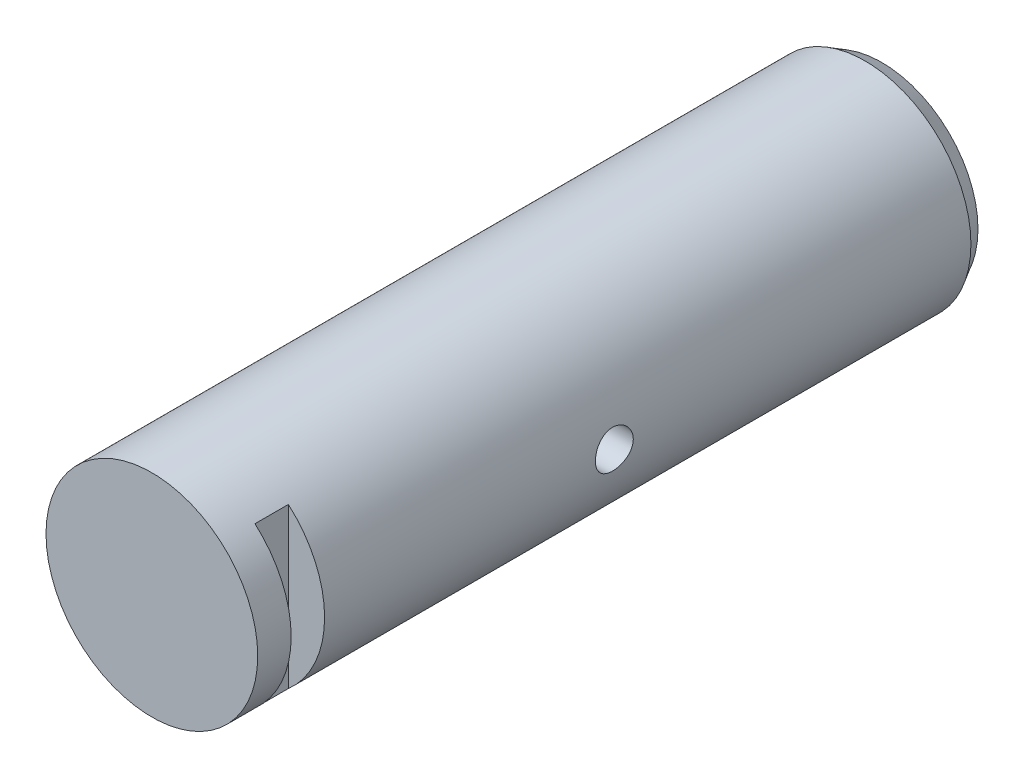
ISO-10303-21;
HEADER;
FILE_DESCRIPTION(('STEP AP214'),'2;1');
FILE_NAME('part.step','',(''),(''),'','','');
FILE_SCHEMA(('AUTOMOTIVE_DESIGN { 1 0 10303 214 1 1 1 1 }'));
ENDSEC;
DATA;
#1=APPLICATION_CONTEXT('core data for automotive mechanical design processes');
#2=APPLICATION_PROTOCOL_DEFINITION('international standard','automotive_design',2000,#1);
#3=PRODUCT_CONTEXT('',#1,'mechanical');
#4=PRODUCT('Part','Part','',(#3));
#5=PRODUCT_RELATED_PRODUCT_CATEGORY('part','',(#4));
#6=PRODUCT_DEFINITION_FORMATION('','',#4);
#7=PRODUCT_DEFINITION_CONTEXT('part definition',#1,'design');
#8=PRODUCT_DEFINITION('design','',#6,#7);
#9=PRODUCT_DEFINITION_SHAPE('','',#8);
#10=(LENGTH_UNIT() NAMED_UNIT(*) SI_UNIT(.MILLI.,.METRE.));
#11=(NAMED_UNIT(*) PLANE_ANGLE_UNIT() SI_UNIT($,.RADIAN.));
#12=(NAMED_UNIT(*) SI_UNIT($,.STERADIAN.) SOLID_ANGLE_UNIT());
#13=UNCERTAINTY_MEASURE_WITH_UNIT(LENGTH_MEASURE(1.E-05),#10,'distance_accuracy_value','');
#14=(GEOMETRIC_REPRESENTATION_CONTEXT(3) GLOBAL_UNCERTAINTY_ASSIGNED_CONTEXT((#13)) GLOBAL_UNIT_ASSIGNED_CONTEXT((#10,
#11,#12)) REPRESENTATION_CONTEXT('',''));
#15=CARTESIAN_POINT('',(0.,0.,0.));
#16=DIRECTION('',(0.,0.,1.));
#17=DIRECTION('',(1.,0.,0.));
#18=AXIS2_PLACEMENT_3D('',#15,#16,#17);
#19=CARTESIAN_POINT('',(0.,0.,-56.));
#20=DIRECTION('',(0.,0.,-1.));
#21=DIRECTION('',(-1.,0.,0.));
#22=AXIS2_PLACEMENT_3D('',#19,#20,#21);
#23=CYLINDRICAL_SURFACE('',#22,3.39999999999999);
#24=CARTESIAN_POINT('',(0.,0.,-56.));
#25=DIRECTION('',(0.,0.,-1.));
#26=DIRECTION('',(-1.,0.,0.));
#27=AXIS2_PLACEMENT_3D('',#24,#25,#26);
#28=CIRCLE('',#27,3.39999999999999);
#29=CARTESIAN_POINT('',(-3.39999999999999,0.,-56.));
#30=VERTEX_POINT('',#29);
#31=EDGE_CURVE('E198',#30,#30,#28,.T.);
#32=ORIENTED_EDGE('',*,*,#31,.T.);
#33=EDGE_LOOP('',(#32));
#34=FACE_BOUND('',#33,.T.);
#35=CARTESIAN_POINT('',(0.,0.,11.));
#36=DIRECTION('',(-0.707106781186547,0.,-0.707106781186547));
#37=DIRECTION('',(0.707106781186547,0.,-0.707106781186547));
#38=AXIS2_PLACEMENT_3D('',#35,#36,#37);
#39=ELLIPSE('',#38,4.80832611206851,3.39999999999999);
#40=CARTESIAN_POINT('',(0.,-3.4,11.));
#41=VERTEX_POINT('',#40);
#42=CARTESIAN_POINT('',(0.,3.39999999999999,11.));
#43=VERTEX_POINT('',#42);
#44=EDGE_CURVE('E202',#41,#43,#39,.F.);
#45=ORIENTED_EDGE('',*,*,#44,.T.);
#46=CARTESIAN_POINT('',(0.,0.,11.));
#47=DIRECTION('',(0.707106781186547,0.,-0.707106781186547));
#48=DIRECTION('',(-0.707106781186547,0.,-0.707106781186547));
#49=AXIS2_PLACEMENT_3D('',#46,#47,#48);
#50=ELLIPSE('',#49,4.80832611206851,3.39999999999999);
#51=EDGE_CURVE('E77',#43,#41,#50,.F.);
#52=ORIENTED_EDGE('',*,*,#51,.T.);
#53=EDGE_LOOP('',(#45,#52));
#54=FACE_BOUND('',#53,.T.);
#55=ADVANCED_FACE('F58',(#34,#54),#23,.F.);
#56=CARTESIAN_POINT('',(0.,0.,-56.));
#57=DIRECTION('',(0.,0.,1.));
#58=DIRECTION('',(1.,0.,0.));
#59=AXIS2_PLACEMENT_3D('',#56,#57,#58);
#60=CYLINDRICAL_SURFACE('',#59,19.);
#61=DIRECTION('',(0.,0.,1.));
#62=VECTOR('',#61,1.);
#63=CARTESIAN_POINT('',(12.5,-14.3090880212542,-56.));
#64=LINE('',#63,#62);
#65=CARTESIAN_POINT('',(12.5,-14.3090880212542,69.));
#66=VERTEX_POINT('',#65);
#67=CARTESIAN_POINT('',(12.5,-14.3090880212542,63.));
#68=VERTEX_POINT('',#67);
#69=EDGE_CURVE('E68',#66,#68,#64,.F.);
#70=ORIENTED_EDGE('',*,*,#69,.F.);
#71=CARTESIAN_POINT('',(0.,0.,69.));
#72=DIRECTION('',(0.,0.,1.));
#73=DIRECTION('',(1.,0.,0.));
#74=AXIS2_PLACEMENT_3D('',#71,#72,#73);
#75=CIRCLE('',#74,19.);
#76=CARTESIAN_POINT('',(12.5,14.3090880212542,69.));
#77=VERTEX_POINT('',#76);
#78=EDGE_CURVE('E11',#77,#66,#75,.F.);
#79=ORIENTED_EDGE('',*,*,#78,.F.);
#80=DIRECTION('',(0.,0.,1.));
#81=VECTOR('',#80,1.);
#82=CARTESIAN_POINT('',(12.5,14.3090880212542,-56.));
#83=LINE('',#82,#81);
#84=CARTESIAN_POINT('',(12.5,14.3090880212542,63.));
#85=VERTEX_POINT('',#84);
#86=EDGE_CURVE('E99',#85,#77,#83,.T.);
#87=ORIENTED_EDGE('',*,*,#86,.F.);
#88=CARTESIAN_POINT('',(0.,0.,63.));
#89=DIRECTION('',(0.,0.,-1.));
#90=DIRECTION('',(-1.,0.,0.));
#91=AXIS2_PLACEMENT_3D('',#88,#89,#90);
#92=CIRCLE('',#91,19.);
#93=EDGE_CURVE('E94',#68,#85,#92,.F.);
#94=ORIENTED_EDGE('',*,*,#93,.F.);
#95=EDGE_LOOP('',(#70,#79,#87,#94));
#96=FACE_BOUND('',#95,.T.);
#97=CARTESIAN_POINT('',(0.,0.,-53.0000000000001));
#98=DIRECTION('',(0.,0.,1.));
#99=DIRECTION('',(1.,0.,0.));
#100=AXIS2_PLACEMENT_3D('',#97,#98,#99);
#101=CIRCLE('',#100,19.);
#102=CARTESIAN_POINT('',(19.,0.,-53.0000000000001));
#103=VERTEX_POINT('',#102);
#104=EDGE_CURVE('E154',#103,#103,#101,.T.);
#105=ORIENTED_EDGE('',*,*,#104,.T.);
#106=EDGE_LOOP('',(#105));
#107=FACE_BOUND('',#106,.T.);
#108=CARTESIAN_POINT('',(-19.,0.,7.60000000000001));
#109=CARTESIAN_POINT('',(-18.9999966349209,-0.189359116148754,7.60000739510284));
#110=CARTESIAN_POINT('',(-18.99713985582,-0.378816292653439,7.6158726611338));
#111=CARTESIAN_POINT('',(-18.9860188360453,-0.752402493709806,7.67887983090921));
#112=CARTESIAN_POINT('',(-18.9777498582218,-0.936526702895269,7.72604913472738));
#113=CARTESIAN_POINT('',(-18.9567304870848,-1.29398914244799,7.85018257048896));
#114=CARTESIAN_POINT('',(-18.9439839809906,-1.46733657564912,7.92712086399056));
#115=CARTESIAN_POINT('',(-18.9154055229009,-1.79864358139372,8.10853729366745));
#116=CARTESIAN_POINT('',(-18.8995738641336,-1.95660461419851,8.21301281290098));
#117=CARTESIAN_POINT('',(-18.8663818606133,-2.25440369777336,8.44775387357689));
#118=CARTESIAN_POINT('',(-18.8490080449846,-2.39404879462585,8.57826232268515));
#119=CARTESIAN_POINT('',(-18.8147911577378,-2.6495837897743,8.86084189315165));
#120=CARTESIAN_POINT('',(-18.797948122286,-2.76547207227252,9.01291447998552));
#121=CARTESIAN_POINT('',(-18.7665691484542,-2.97099402925277,9.33565313650552));
#122=CARTESIAN_POINT('',(-18.7520505970165,-3.06043372862368,9.50644456944872));
#123=CARTESIAN_POINT('',(-18.7271530893692,-3.20927847227692,9.86093146973737));
#124=CARTESIAN_POINT('',(-18.7167738093077,-3.26868586635062,10.0446259262416));
#125=CARTESIAN_POINT('',(-18.7014650301702,-3.35516512484591,10.4176477673485));
#126=CARTESIAN_POINT('',(-18.6964790933344,-3.38257209811784,10.6068951010301));
#127=CARTESIAN_POINT('',(-18.69235114719,-3.40531220803425,10.9873628044778));
#128=CARTESIAN_POINT('',(-18.6932086609569,-3.40064796223401,11.1785830119519));
#129=CARTESIAN_POINT('',(-18.7006192804987,-3.35965028298724,11.5551558211514));
#130=CARTESIAN_POINT('',(-18.7071042060553,-3.32369593703936,11.7405512330063));
#131=CARTESIAN_POINT('',(-18.7249320285173,-3.221734789343,12.1026353029879));
#132=CARTESIAN_POINT('',(-18.7362751150751,-3.15572681435812,12.2793236209078));
#133=CARTESIAN_POINT('',(-18.7626134640921,-2.99515565509624,12.6200980357));
#134=CARTESIAN_POINT('',(-18.7776284515749,-2.90043756235276,12.7841095531177));
#135=CARTESIAN_POINT('',(-18.8096054823071,-2.68524459961301,13.094054289061));
#136=CARTESIAN_POINT('',(-18.8265677059959,-2.56476734176922,13.2399858296095));
#137=CARTESIAN_POINT('',(-18.8608261487862,-2.29942291648305,13.5118201762315));
#138=CARTESIAN_POINT('',(-18.8781236715029,-2.1542310689154,13.637406104729));
#139=CARTESIAN_POINT('',(-18.9108798607181,-1.8446702868463,13.8624837075214));
#140=CARTESIAN_POINT('',(-18.9263385117616,-1.6803011911899,13.9619751625099));
#141=CARTESIAN_POINT('',(-18.9537023046531,-1.33673505364186,14.1320786876557));
#142=CARTESIAN_POINT('',(-18.9656036471012,-1.15752241699953,14.2026599096823));
#143=CARTESIAN_POINT('',(-18.9844820701314,-0.789525108664183,14.3126302553381));
#144=CARTESIAN_POINT('',(-18.9914596264956,-0.600741363711166,14.3520223927931));
#145=CARTESIAN_POINT('',(-18.9996395277903,-0.221689022440057,14.3980601931527));
#146=CARTESIAN_POINT('',(-19.0009184998551,-0.0314747990638467,14.405140376782));
#147=CARTESIAN_POINT('',(-18.9977680347034,0.347420440928693,14.3875158305965));
#148=CARTESIAN_POINT('',(-18.9933388520024,0.536101525527205,14.3628125179457));
#149=CARTESIAN_POINT('',(-18.9793173345974,0.905211583009181,14.2826835680585));
#150=CARTESIAN_POINT('',(-18.9697616265791,1.08568936212386,14.22747578862));
#151=CARTESIAN_POINT('',(-18.9465540454197,1.43482762283372,14.0881393143843));
#152=CARTESIAN_POINT('',(-18.9329019139614,1.60348735836489,14.0040087956934));
#153=CARTESIAN_POINT('',(-18.9028249257681,1.92607037485075,13.8082391156509));
#154=CARTESIAN_POINT('',(-18.8863735762729,2.07982847751297,13.6963319302007));
#155=CARTESIAN_POINT('',(-18.852595910538,2.36653881416634,13.4485507612175));
#156=CARTESIAN_POINT('',(-18.8352695204427,2.49948928804732,13.3126747522355));
#157=CARTESIAN_POINT('',(-18.8014430595408,2.74244444474002,13.0188533637239));
#158=CARTESIAN_POINT('',(-18.78495543858,2.85215381250747,12.8606621275437));
#159=CARTESIAN_POINT('',(-18.7549160166177,3.04344209969357,12.5278403204927));
#160=CARTESIAN_POINT('',(-18.7413641128602,3.12502200376045,12.3532103253193));
#161=CARTESIAN_POINT('',(-18.7188264245687,3.25730709364541,11.9932500098118));
#162=CARTESIAN_POINT('',(-18.7098199252254,3.30815255943244,11.8079725989931));
#163=CARTESIAN_POINT('',(-18.6973434437131,3.37796206615852,11.431330114278));
#164=CARTESIAN_POINT('',(-18.6938728984918,3.39692934938192,11.2399656615035));
#165=CARTESIAN_POINT('',(-18.6928880346328,3.40234319134434,10.8595352488396));
#166=CARTESIAN_POINT('',(-18.6952884808671,3.38925512617539,10.6704759737356));
#167=CARTESIAN_POINT('',(-18.7055870627166,3.3319433273961,10.2972976229357));
#168=CARTESIAN_POINT('',(-18.7134851722051,3.28771974175138,10.1131785237669));
#169=CARTESIAN_POINT('',(-18.7338547388841,3.16958106311173,9.75532754358542));
#170=CARTESIAN_POINT('',(-18.746319103037,3.09571200330979,9.58158003596089));
#171=CARTESIAN_POINT('',(-18.7744225034866,2.92042873118774,9.24886941806226));
#172=CARTESIAN_POINT('',(-18.7900617361021,2.81901281536991,9.08990722292836));
#173=CARTESIAN_POINT('',(-18.8230197247812,2.58987842643082,8.78893976979962));
#174=CARTESIAN_POINT('',(-18.8403585009623,2.46181965856844,8.64719573784659));
#175=CARTESIAN_POINT('',(-18.8746080286539,2.18374808407311,8.38705151465689));
#176=CARTESIAN_POINT('',(-18.8915186808027,2.03373023484456,8.26865669993875));
#177=CARTESIAN_POINT('',(-18.9231663993433,1.71454851307093,8.05768408187032));
#178=CARTESIAN_POINT('',(-18.9378847672342,1.54523951687639,7.96532297096771));
#179=CARTESIAN_POINT('',(-18.9633074648247,1.19330528614379,7.8105005800182));
#180=CARTESIAN_POINT('',(-18.9740156598171,1.01069307810337,7.74801049198693));
#181=CARTESIAN_POINT('',(-18.9879627193211,0.689556735628872,7.66776605789308));
#182=CARTESIAN_POINT('',(-18.992451791999,0.55293907866632,7.64239604090775));
#183=CARTESIAN_POINT('',(-18.998471633606,0.277565147922436,7.6085104844349));
#184=CARTESIAN_POINT('',(-19.0000024667574,0.13880892063465,7.59999457905032));
#185=CARTESIAN_POINT('',(-19.,0.,7.60000000000001));
#186=B_SPLINE_CURVE_WITH_KNOTS('',3,(#108,#109,#110,#111,#112,#113,#114,#115,#116,#117,#118,
#119,#120,#121,#122,#123,#124,#125,#126,#127,#128,#129,#130,#131,#132,#133,#134,#135,#136,#137,
#138,#139,#140,#141,#142,#143,#144,#145,#146,#147,#148,#149,#150,#151,#152,#153,#154,#155,#156,
#157,#158,#159,#160,#161,#162,#163,#164,#165,#166,#167,#168,#169,#170,#171,#172,#173,#174,#175,
#176,#177,#178,#179,#180,#181,#182,#183,#184,#185),.UNSPECIFIED.,.T.,.F.,(4,2,2,2,2,2,2,2,2,2,2,
2,2,2,2,2,2,2,2,2,2,2,2,2,2,2,2,2,2,2,2,2,2,2,2,2,2,2,4),(0.,0.567569821708365,1.13563708729389,
1.70321239244777,2.27073377872327,2.84382163815749,3.41694846270904,3.99417992316399,
4.57136621281049,5.14245239388971,5.71349196520636,6.27770806931202,6.84194620122779,
7.40928463320321,7.97667567967408,8.55219507118145,9.12771929938312,9.70385604029428,
10.2799371018632,10.8482479323349,11.4165334238169,11.9808118150049,12.5451257966195,
13.1151124371865,13.6851472666984,14.2620404102667,14.8389133581249,15.4131330256255,
15.9872942865302,16.5531694756568,17.1190419755876,17.6840391733022,18.2490713184047,
18.8218200155169,19.3947004432856,19.9722172111757,20.5491758853879,20.9652396396078,
21.3812943611257),.UNSPECIFIED.);
#187=CARTESIAN_POINT('',(-19.,0.,7.60000000000001));
#188=VERTEX_POINT('',#187);
#189=EDGE_CURVE('E117',#188,#188,#186,.T.);
#190=ORIENTED_EDGE('',*,*,#189,.F.);
#191=EDGE_LOOP('',(#190));
#192=FACE_BOUND('',#191,.T.);
#193=CARTESIAN_POINT('',(19.,0.,14.4));
#194=CARTESIAN_POINT('',(18.9999966349209,-0.189359116148753,14.3999926048972));
#195=CARTESIAN_POINT('',(18.99713985582,-0.378816292653439,14.3841273388662));
#196=CARTESIAN_POINT('',(18.9860188360453,-0.752402493709806,14.3211201690908));
#197=CARTESIAN_POINT('',(18.9777498582218,-0.936526702895269,14.2739508652726));
#198=CARTESIAN_POINT('',(18.9567304870848,-1.29398914244799,14.1498174295111));
#199=CARTESIAN_POINT('',(18.9439839809906,-1.46733657564912,14.0728791360095));
#200=CARTESIAN_POINT('',(18.9154055229009,-1.79864358139372,13.8914627063326));
#201=CARTESIAN_POINT('',(18.8995738641336,-1.95660461419851,13.786987187099));
#202=CARTESIAN_POINT('',(18.8663818606133,-2.25440369777336,13.5522461264231));
#203=CARTESIAN_POINT('',(18.8490080449846,-2.39404879462585,13.4217376773149));
#204=CARTESIAN_POINT('',(18.8147911577378,-2.6495837897743,13.1391581068484));
#205=CARTESIAN_POINT('',(18.797948122286,-2.76547207227252,12.9870855200145));
#206=CARTESIAN_POINT('',(18.7665691484542,-2.97099402925277,12.6643468634945));
#207=CARTESIAN_POINT('',(18.7520505970165,-3.06043372862368,12.4935554305513));
#208=CARTESIAN_POINT('',(18.7271530893692,-3.20927847227692,12.1390685302627));
#209=CARTESIAN_POINT('',(18.7167738093077,-3.26868586635062,11.9553740737585));
#210=CARTESIAN_POINT('',(18.7014650301702,-3.35516512484591,11.5823522326515));
#211=CARTESIAN_POINT('',(18.6964790933344,-3.38257209811784,11.3931048989699));
#212=CARTESIAN_POINT('',(18.69235114719,-3.40531220803425,11.0126371955222));
#213=CARTESIAN_POINT('',(18.6932086609569,-3.40064796223401,10.8214169880481));
#214=CARTESIAN_POINT('',(18.7006192804987,-3.35965028298724,10.4448441788486));
#215=CARTESIAN_POINT('',(18.7071042060553,-3.32369593703936,10.2594487669937));
#216=CARTESIAN_POINT('',(18.7249320285173,-3.221734789343,9.89736469701213));
#217=CARTESIAN_POINT('',(18.7362751150751,-3.15572681435812,9.72067637909223));
#218=CARTESIAN_POINT('',(18.7626134640921,-2.99515565509624,9.37990196429999));
#219=CARTESIAN_POINT('',(18.7776284515749,-2.90043756235276,9.2158904468823));
#220=CARTESIAN_POINT('',(18.8096054823071,-2.68524459961301,8.90594571093905));
#221=CARTESIAN_POINT('',(18.8265677059959,-2.56476734176922,8.76001417039052));
#222=CARTESIAN_POINT('',(18.8608261487862,-2.29942291648305,8.48817982376854));
#223=CARTESIAN_POINT('',(18.8781236715029,-2.1542310689154,8.36259389527098));
#224=CARTESIAN_POINT('',(18.9108798607181,-1.8446702868463,8.1375162924786));
#225=CARTESIAN_POINT('',(18.9263385117616,-1.6803011911899,8.03802483749011));
#226=CARTESIAN_POINT('',(18.9537023046531,-1.33673505364186,7.86792131234436));
#227=CARTESIAN_POINT('',(18.9656036471012,-1.15752241699953,7.79734009031776));
#228=CARTESIAN_POINT('',(18.9844820701314,-0.789525108664183,7.6873697446619));
#229=CARTESIAN_POINT('',(18.9914596264956,-0.600741363711167,7.64797760720692));
#230=CARTESIAN_POINT('',(18.9996395277903,-0.221689022440058,7.60193980684731));
#231=CARTESIAN_POINT('',(19.0009184998551,-0.0314747990638471,7.59485962321803));
#232=CARTESIAN_POINT('',(18.9977680347034,0.347420440928693,7.6124841694035));
#233=CARTESIAN_POINT('',(18.9933388520024,0.536101525527204,7.63718748205435));
#234=CARTESIAN_POINT('',(18.9793173345974,0.90521158300918,7.71731643194147));
#235=CARTESIAN_POINT('',(18.9697616265791,1.08568936212386,7.77252421138005));
#236=CARTESIAN_POINT('',(18.9465540454197,1.43482762283372,7.91186068561576));
#237=CARTESIAN_POINT('',(18.9329019139614,1.60348735836489,7.99599120430657));
#238=CARTESIAN_POINT('',(18.9028249257681,1.92607037485075,8.19176088434912));
#239=CARTESIAN_POINT('',(18.8863735762729,2.07982847751297,8.30366806979928));
#240=CARTESIAN_POINT('',(18.852595910538,2.36653881416634,8.55144923878256));
#241=CARTESIAN_POINT('',(18.8352695204427,2.49948928804732,8.68732524776455));
#242=CARTESIAN_POINT('',(18.8014430595408,2.74244444474002,8.98114663627607));
#243=CARTESIAN_POINT('',(18.78495543858,2.85215381250747,9.13933787245632));
#244=CARTESIAN_POINT('',(18.7549160166177,3.04344209969357,9.47215967950735));
#245=CARTESIAN_POINT('',(18.7413641128602,3.12502200376045,9.64678967468073));
#246=CARTESIAN_POINT('',(18.7188264245687,3.25730709364541,10.0067499901882));
#247=CARTESIAN_POINT('',(18.7098199252254,3.30815255943243,10.1920274010069));
#248=CARTESIAN_POINT('',(18.6973434437131,3.37796206615852,10.568669885722));
#249=CARTESIAN_POINT('',(18.6938728984918,3.39692934938192,10.7600343384965));
#250=CARTESIAN_POINT('',(18.6928880346328,3.40234319134434,11.1404647511604));
#251=CARTESIAN_POINT('',(18.6952884808671,3.38925512617539,11.3295240262644));
#252=CARTESIAN_POINT('',(18.7055870627166,3.3319433273961,11.7027023770643));
#253=CARTESIAN_POINT('',(18.7134851722051,3.28771974175138,11.8868214762332));
#254=CARTESIAN_POINT('',(18.7338547388841,3.16958106311173,12.2446724564146));
#255=CARTESIAN_POINT('',(18.746319103037,3.09571200330979,12.4184199640391));
#256=CARTESIAN_POINT('',(18.7744225034866,2.92042873118775,12.7511305819378));
#257=CARTESIAN_POINT('',(18.7900617361021,2.81901281536991,12.9100927770717));
#258=CARTESIAN_POINT('',(18.8230197247812,2.58987842643082,13.2110602302004));
#259=CARTESIAN_POINT('',(18.8403585009623,2.46181965856844,13.3528042621534));
#260=CARTESIAN_POINT('',(18.8746080286539,2.18374808407311,13.6129484853431));
#261=CARTESIAN_POINT('',(18.8915186808027,2.03373023484456,13.7313433000613));
#262=CARTESIAN_POINT('',(18.9231663993433,1.71454851307094,13.9423159181297));
#263=CARTESIAN_POINT('',(18.9378847672342,1.54523951687639,14.0346770290323));
#264=CARTESIAN_POINT('',(18.9633074648247,1.19330528614379,14.1894994199818));
#265=CARTESIAN_POINT('',(18.9740156598171,1.01069307810337,14.2519895080131));
#266=CARTESIAN_POINT('',(18.9879627193211,0.689556735628875,14.3322339421069));
#267=CARTESIAN_POINT('',(18.992451791999,0.552939078666323,14.3576039590923));
#268=CARTESIAN_POINT('',(18.998471633606,0.277565147922439,14.3914895155651));
#269=CARTESIAN_POINT('',(19.0000024667574,0.138808920634652,14.4000054209497));
#270=CARTESIAN_POINT('',(19.,0.,14.4));
#271=B_SPLINE_CURVE_WITH_KNOTS('',3,(#193,#194,#195,#196,#197,#198,#199,#200,#201,#202,#203,
#204,#205,#206,#207,#208,#209,#210,#211,#212,#213,#214,#215,#216,#217,#218,#219,#220,#221,#222,
#223,#224,#225,#226,#227,#228,#229,#230,#231,#232,#233,#234,#235,#236,#237,#238,#239,#240,#241,
#242,#243,#244,#245,#246,#247,#248,#249,#250,#251,#252,#253,#254,#255,#256,#257,#258,#259,#260,
#261,#262,#263,#264,#265,#266,#267,#268,#269,#270),.UNSPECIFIED.,.T.,.F.,(4,2,2,2,2,2,2,2,2,2,2,
2,2,2,2,2,2,2,2,2,2,2,2,2,2,2,2,2,2,2,2,2,2,2,2,2,2,2,4),(0.,0.567569821708365,1.13563708729389,
1.70321239244777,2.27073377872327,2.84382163815749,3.41694846270904,3.99417992316399,
4.57136621281049,5.14245239388971,5.71349196520636,6.27770806931202,6.84194620122779,
7.40928463320321,7.97667567967408,8.55219507118145,9.12771929938312,9.70385604029428,
10.2799371018632,10.8482479323349,11.4165334238169,11.9808118150049,12.5451257966195,
13.1151124371865,13.6851472666984,14.2620404102666,14.8389133581249,15.4131330256255,
15.9872942865302,16.5531694756568,17.1190419755876,17.6840391733022,18.2490713184047,
18.8218200155169,19.3947004432856,19.9722172111757,20.5491758853879,20.9652396396078,
21.3812943611257),.UNSPECIFIED.);
#272=CARTESIAN_POINT('',(19.,0.,14.4));
#273=VERTEX_POINT('',#272);
#274=EDGE_CURVE('E146',#273,#273,#271,.T.);
#275=ORIENTED_EDGE('',*,*,#274,.F.);
#276=EDGE_LOOP('',(#275));
#277=FACE_BOUND('',#276,.T.);
#278=CARTESIAN_POINT('',(0.,0.,75.));
#279=DIRECTION('',(0.,0.,1.));
#280=DIRECTION('',(1.,0.,0.));
#281=AXIS2_PLACEMENT_3D('',#278,#279,#280);
#282=CIRCLE('',#281,19.);
#283=CARTESIAN_POINT('',(19.,0.,75.));
#284=VERTEX_POINT('',#283);
#285=EDGE_CURVE('E155',#284,#284,#282,.T.);
#286=ORIENTED_EDGE('',*,*,#285,.F.);
#287=EDGE_LOOP('',(#286));
#288=FACE_BOUND('',#287,.T.);
#289=ADVANCED_FACE('F96',(#96,#107,#192,#277,#288),#60,.T.);
#290=CARTESIAN_POINT('',(0.,0.,-56.));
#291=DIRECTION('',(0.,0.,1.));
#292=DIRECTION('',(1.,0.,0.));
#293=AXIS2_PLACEMENT_3D('',#290,#291,#292);
#294=PLANE('',#293);
#295=CARTESIAN_POINT('',(0.,0.,-56.));
#296=DIRECTION('',(0.,0.,1.));
#297=DIRECTION('',(1.,0.,0.));
#298=AXIS2_PLACEMENT_3D('',#295,#296,#297);
#299=CIRCLE('',#298,17.2679491924312);
#300=CARTESIAN_POINT('',(17.2679491924312,0.,-56.));
#301=VERTEX_POINT('',#300);
#302=EDGE_CURVE('E104',#301,#301,#299,.F.);
#303=ORIENTED_EDGE('',*,*,#302,.T.);
#304=EDGE_LOOP('',(#303));
#305=FACE_BOUND('',#304,.T.);
#306=ORIENTED_EDGE('',*,*,#31,.F.);
#307=EDGE_LOOP('',(#306));
#308=FACE_BOUND('',#307,.T.);
#309=ADVANCED_FACE('F179',(#305,#308),#294,.F.);
#310=CARTESIAN_POINT('',(0.,0.,75.));
#311=DIRECTION('',(0.,0.,1.));
#312=DIRECTION('',(1.,0.,0.));
#313=AXIS2_PLACEMENT_3D('',#310,#311,#312);
#314=PLANE('',#313);
#315=ORIENTED_EDGE('',*,*,#285,.T.);
#316=EDGE_LOOP('',(#315));
#317=FACE_BOUND('',#316,.T.);
#318=ADVANCED_FACE('F188',(#317),#314,.T.);
#319=CARTESIAN_POINT('',(0.,0.,19.));
#320=DIRECTION('',(0.,0.,-1.));
#321=DIRECTION('',(-1.,0.,0.));
#322=AXIS2_PLACEMENT_3D('',#319,#320,#321);
#323=CONICAL_SURFACE('',#322,3.39999999999998,1.02974425867665);
#324=CARTESIAN_POINT('',(0.,0.,21.0429261046937));
#325=VERTEX_POINT('',#324);
#326=VERTEX_LOOP('',#325);
#327=FACE_BOUND('',#326,.T.);
#328=CARTESIAN_POINT('',(0.,0.,19.));
#329=DIRECTION('',(0.,0.,-1.));
#330=DIRECTION('',(-1.,0.,0.));
#331=AXIS2_PLACEMENT_3D('',#328,#329,#330);
#332=CIRCLE('',#331,3.39999999999998);
#333=CARTESIAN_POINT('',(-3.39999999999998,0.,19.));
#334=VERTEX_POINT('',#333);
#335=EDGE_CURVE('E195',#334,#334,#332,.T.);
#336=ORIENTED_EDGE('',*,*,#335,.T.);
#337=EDGE_LOOP('',(#336));
#338=FACE_BOUND('',#337,.T.);
#339=ADVANCED_FACE('F183',(#327,#338),#323,.F.);
#340=CARTESIAN_POINT('',(0.,0.,11.));
#341=DIRECTION('',(0.707106781186547,0.,-0.707106781186547));
#342=DIRECTION('',(-0.707106781186547,0.,-0.707106781186547));
#343=AXIS2_PLACEMENT_3D('',#340,#341,#342);
#344=ELLIPSE('',#343,4.80832611206851,3.39999999999999);
#345=EDGE_CURVE('E192',#43,#41,#344,.T.);
#346=ORIENTED_EDGE('',*,*,#345,.T.);
#347=CARTESIAN_POINT('',(0.,0.,11.));
#348=DIRECTION('',(-0.707106781186547,0.,-0.707106781186547));
#349=DIRECTION('',(0.707106781186547,0.,-0.707106781186547));
#350=AXIS2_PLACEMENT_3D('',#347,#348,#349);
#351=ELLIPSE('',#350,4.80832611206851,3.39999999999999);
#352=EDGE_CURVE('E127',#41,#43,#351,.T.);
#353=ORIENTED_EDGE('',*,*,#352,.T.);
#354=EDGE_LOOP('',(#346,#353));
#355=FACE_BOUND('',#354,.T.);
#356=ORIENTED_EDGE('',*,*,#335,.F.);
#357=EDGE_LOOP('',(#356));
#358=FACE_BOUND('',#357,.T.);
#359=ADVANCED_FACE('F142',(#355,#358),#23,.F.);
#360=CARTESIAN_POINT('',(0.,0.,11.));
#361=DIRECTION('',(-1.,0.,0.));
#362=DIRECTION('',(0.,0.,1.));
#363=AXIS2_PLACEMENT_3D('',#360,#361,#362);
#364=CYLINDRICAL_SURFACE('',#363,3.4);
#365=ORIENTED_EDGE('',*,*,#274,.T.);
#366=EDGE_LOOP('',(#365));
#367=FACE_BOUND('',#366,.T.);
#368=ORIENTED_EDGE('',*,*,#345,.F.);
#369=ORIENTED_EDGE('',*,*,#44,.F.);
#370=EDGE_LOOP('',(#368,#369));
#371=FACE_BOUND('',#370,.T.);
#372=ADVANCED_FACE('F136',(#367,#371),#364,.F.);
#373=CARTESIAN_POINT('',(0.,0.,11.));
#374=DIRECTION('',(1.,0.,0.));
#375=DIRECTION('',(0.,0.,-1.));
#376=AXIS2_PLACEMENT_3D('',#373,#374,#375);
#377=CYLINDRICAL_SURFACE('',#376,3.4);
#378=ORIENTED_EDGE('',*,*,#189,.T.);
#379=EDGE_LOOP('',(#378));
#380=FACE_BOUND('',#379,.T.);
#381=ORIENTED_EDGE('',*,*,#352,.F.);
#382=ORIENTED_EDGE('',*,*,#51,.F.);
#383=EDGE_LOOP('',(#381,#382));
#384=FACE_BOUND('',#383,.T.);
#385=ADVANCED_FACE('F131',(#380,#384),#377,.F.);
#386=CARTESIAN_POINT('',(0.,0.,-53.0000000000001));
#387=DIRECTION('',(0.,0.,1.));
#388=DIRECTION('',(1.,0.,0.));
#389=AXIS2_PLACEMENT_3D('',#386,#387,#388);
#390=CONICAL_SURFACE('',#389,19.,0.523598775598298);
#391=ORIENTED_EDGE('',*,*,#302,.F.);
#392=EDGE_LOOP('',(#391));
#393=FACE_BOUND('',#392,.T.);
#394=ORIENTED_EDGE('',*,*,#104,.F.);
#395=EDGE_LOOP('',(#394));
#396=FACE_BOUND('',#395,.T.);
#397=ADVANCED_FACE('F61',(#393,#396),#390,.T.);
#398=CARTESIAN_POINT('',(19.,-19.,69.));
#399=DIRECTION('',(0.,0.,1.));
#400=DIRECTION('',(1.,0.,0.));
#401=AXIS2_PLACEMENT_3D('',#398,#399,#400);
#402=PLANE('',#401);
#403=ORIENTED_EDGE('',*,*,#78,.T.);
#404=DIRECTION('',(0.,1.,0.));
#405=VECTOR('',#404,1.);
#406=CARTESIAN_POINT('',(12.5,-19.,69.));
#407=LINE('',#406,#405);
#408=EDGE_CURVE('E111',#66,#77,#407,.T.);
#409=ORIENTED_EDGE('',*,*,#408,.T.);
#410=EDGE_LOOP('',(#403,#409));
#411=FACE_BOUND('',#410,.T.);
#412=ADVANCED_FACE('F165',(#411),#402,.F.);
#413=CARTESIAN_POINT('',(12.5,-19.,63.));
#414=DIRECTION('',(-1.,0.,0.));
#415=DIRECTION('',(0.,0.,1.));
#416=AXIS2_PLACEMENT_3D('',#413,#414,#415);
#417=PLANE('',#416);
#418=ORIENTED_EDGE('',*,*,#69,.T.);
#419=DIRECTION('',(0.,1.,0.));
#420=VECTOR('',#419,1.);
#421=CARTESIAN_POINT('',(12.5,-19.,63.));
#422=LINE('',#421,#420);
#423=EDGE_CURVE('E109',#68,#85,#422,.T.);
#424=ORIENTED_EDGE('',*,*,#423,.T.);
#425=ORIENTED_EDGE('',*,*,#86,.T.);
#426=ORIENTED_EDGE('',*,*,#408,.F.);
#427=EDGE_LOOP('',(#418,#424,#425,#426));
#428=FACE_BOUND('',#427,.T.);
#429=ADVANCED_FACE('F108',(#428),#417,.F.);
#430=CARTESIAN_POINT('',(19.,-19.,63.));
#431=DIRECTION('',(0.,0.,-1.));
#432=DIRECTION('',(-1.,0.,0.));
#433=AXIS2_PLACEMENT_3D('',#430,#431,#432);
#434=PLANE('',#433);
#435=ORIENTED_EDGE('',*,*,#423,.F.);
#436=ORIENTED_EDGE('',*,*,#93,.T.);
#437=EDGE_LOOP('',(#435,#436));
#438=FACE_BOUND('',#437,.T.);
#439=ADVANCED_FACE('F113',(#438),#434,.F.);
#440=CLOSED_SHELL('',(#55,#289,#309,#318,#339,#359,#372,#385,#397,#412,#429,#439));
#441=MANIFOLD_SOLID_BREP('B2',#440);
#442=ADVANCED_BREP_SHAPE_REPRESENTATION('',(#18,#441),#14);
#443=SHAPE_DEFINITION_REPRESENTATION(#9,#442);
ENDSEC;
END-ISO-10303-21;
